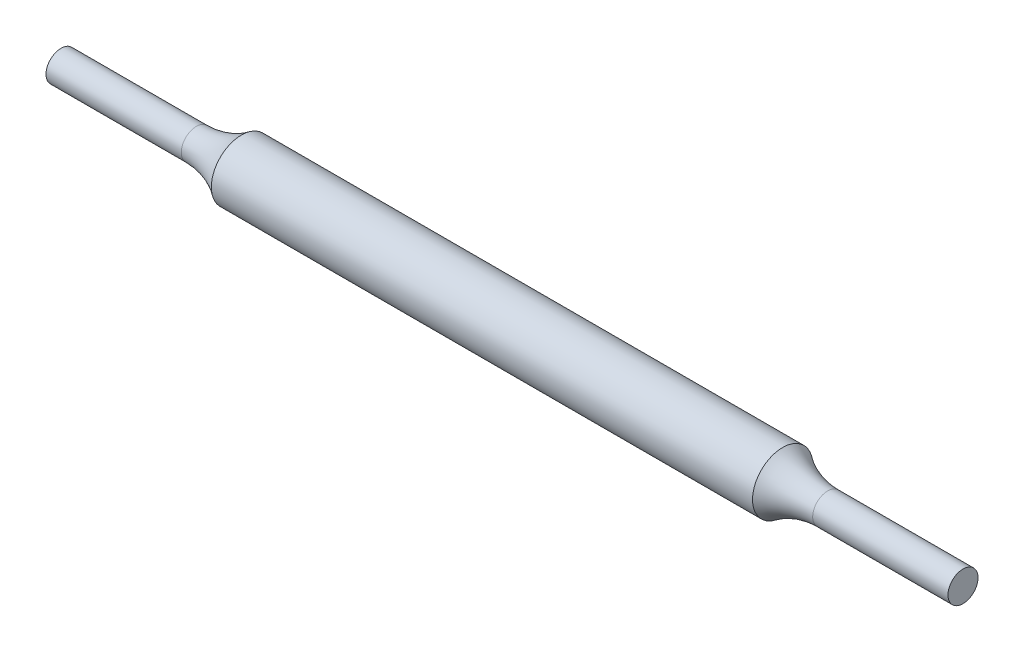
ISO-10303-21;
HEADER;
FILE_DESCRIPTION(('STEP AP214'),'2;1');
FILE_NAME('part.step','',(''),(''),'','','');
FILE_SCHEMA(('AUTOMOTIVE_DESIGN { 1 0 10303 214 1 1 1 1 }'));
ENDSEC;
DATA;
#1=APPLICATION_CONTEXT('core data for automotive mechanical design processes');
#2=APPLICATION_PROTOCOL_DEFINITION('international standard','automotive_design',2000,#1);
#3=PRODUCT_CONTEXT('',#1,'mechanical');
#4=PRODUCT('Part','Part','',(#3));
#5=PRODUCT_RELATED_PRODUCT_CATEGORY('part','',(#4));
#6=PRODUCT_DEFINITION_FORMATION('','',#4);
#7=PRODUCT_DEFINITION_CONTEXT('part definition',#1,'design');
#8=PRODUCT_DEFINITION('design','',#6,#7);
#9=PRODUCT_DEFINITION_SHAPE('','',#8);
#10=(LENGTH_UNIT() NAMED_UNIT(*) SI_UNIT(.MILLI.,.METRE.));
#11=(NAMED_UNIT(*) PLANE_ANGLE_UNIT() SI_UNIT($,.RADIAN.));
#12=(NAMED_UNIT(*) SI_UNIT($,.STERADIAN.) SOLID_ANGLE_UNIT());
#13=UNCERTAINTY_MEASURE_WITH_UNIT(LENGTH_MEASURE(1.E-05),#10,'distance_accuracy_value','');
#14=(GEOMETRIC_REPRESENTATION_CONTEXT(3) GLOBAL_UNCERTAINTY_ASSIGNED_CONTEXT((#13)) GLOBAL_UNIT_ASSIGNED_CONTEXT((#10,
#11,#12)) REPRESENTATION_CONTEXT('',''));
#15=CARTESIAN_POINT('',(0.,0.,0.));
#16=DIRECTION('',(0.,0.,1.));
#17=DIRECTION('',(1.,0.,0.));
#18=AXIS2_PLACEMENT_3D('',#15,#16,#17);
#19=CARTESIAN_POINT('',(0.,0.,0.));
#20=DIRECTION('',(1.,0.,0.));
#21=DIRECTION('',(0.,0.,-1.));
#22=AXIS2_PLACEMENT_3D('',#19,#20,#21);
#23=PLANE('',#22);
#24=CARTESIAN_POINT('',(0.,0.,0.));
#25=DIRECTION('',(-1.,0.,0.));
#26=DIRECTION('',(0.,0.,1.));
#27=AXIS2_PLACEMENT_3D('',#24,#25,#26);
#28=CIRCLE('',#27,1.);
#29=CARTESIAN_POINT('',(0.,0.,1.));
#30=VERTEX_POINT('',#29);
#31=EDGE_CURVE('E57',#30,#30,#28,.T.);
#32=ORIENTED_EDGE('',*,*,#31,.T.);
#33=EDGE_LOOP('',(#32));
#34=FACE_BOUND('',#33,.T.);
#35=ADVANCED_FACE('F35',(#34),#23,.F.);
#36=CARTESIAN_POINT('',(60.,0.,0.));
#37=DIRECTION('',(-1.,0.,0.));
#38=DIRECTION('',(0.,0.,1.));
#39=AXIS2_PLACEMENT_3D('',#36,#37,#38);
#40=PLANE('',#39);
#41=CARTESIAN_POINT('',(60.,0.,0.));
#42=DIRECTION('',(-1.,0.,0.));
#43=DIRECTION('',(0.,0.,1.));
#44=AXIS2_PLACEMENT_3D('',#41,#42,#43);
#45=CIRCLE('',#44,1.);
#46=CARTESIAN_POINT('',(60.,0.,1.));
#47=VERTEX_POINT('',#46);
#48=EDGE_CURVE('E10',#47,#47,#45,.T.);
#49=ORIENTED_EDGE('',*,*,#48,.F.);
#50=EDGE_LOOP('',(#49));
#51=FACE_BOUND('',#50,.T.);
#52=ADVANCED_FACE('F87',(#51),#40,.F.);
#53=CARTESIAN_POINT('',(0.,0.,0.));
#54=DIRECTION('',(-1.,0.,0.));
#55=DIRECTION('',(0.,0.,1.));
#56=AXIS2_PLACEMENT_3D('',#53,#54,#55);
#57=CYLINDRICAL_SURFACE('',#56,1.00000000000001);
#58=CARTESIAN_POINT('',(51.,0.,0.));
#59=DIRECTION('',(-1.,0.,0.));
#60=DIRECTION('',(0.,0.,1.));
#61=AXIS2_PLACEMENT_3D('',#58,#59,#60);
#62=CIRCLE('',#61,1.00000000000002);
#63=CARTESIAN_POINT('',(51.,0.,1.00000000000002));
#64=VERTEX_POINT('',#63);
#65=EDGE_CURVE('E41',#64,#64,#62,.T.);
#66=ORIENTED_EDGE('',*,*,#65,.F.);
#67=EDGE_LOOP('',(#66));
#68=FACE_BOUND('',#67,.T.);
#69=ORIENTED_EDGE('',*,*,#48,.T.);
#70=EDGE_LOOP('',(#69));
#71=FACE_BOUND('',#70,.T.);
#72=ADVANCED_FACE('F82',(#68,#71),#57,.T.);
#73=CARTESIAN_POINT('',(51.,0.,0.));
#74=DIRECTION('',(-1.,0.,0.));
#75=DIRECTION('',(0.,0.,1.));
#76=AXIS2_PLACEMENT_3D('',#73,#74,#75);
#77=TOROIDAL_SURFACE('',#76,6.00000000000003,5.00000000000002);
#78=CARTESIAN_POINT('',(48.,0.,0.));
#79=DIRECTION('',(-1.,0.,0.));
#80=DIRECTION('',(0.,0.,1.));
#81=AXIS2_PLACEMENT_3D('',#78,#79,#80);
#82=CIRCLE('',#81,2.00000000000001);
#83=CARTESIAN_POINT('',(48.,0.,2.00000000000001));
#84=VERTEX_POINT('',#83);
#85=EDGE_CURVE('E45',#84,#84,#82,.T.);
#86=ORIENTED_EDGE('',*,*,#85,.F.);
#87=EDGE_LOOP('',(#86));
#88=FACE_BOUND('',#87,.T.);
#89=ORIENTED_EDGE('',*,*,#65,.T.);
#90=EDGE_LOOP('',(#89));
#91=FACE_BOUND('',#90,.T.);
#92=ADVANCED_FACE('F77',(#88,#91),#77,.F.);
#93=CARTESIAN_POINT('',(0.,0.,0.));
#94=DIRECTION('',(-1.,0.,0.));
#95=DIRECTION('',(0.,0.,1.));
#96=AXIS2_PLACEMENT_3D('',#93,#94,#95);
#97=CYLINDRICAL_SURFACE('',#96,2.);
#98=CARTESIAN_POINT('',(12.,0.,0.));
#99=DIRECTION('',(-1.,0.,0.));
#100=DIRECTION('',(0.,0.,1.));
#101=AXIS2_PLACEMENT_3D('',#98,#99,#100);
#102=CIRCLE('',#101,2.);
#103=CARTESIAN_POINT('',(12.,0.,2.));
#104=VERTEX_POINT('',#103);
#105=EDGE_CURVE('E49',#104,#104,#102,.T.);
#106=ORIENTED_EDGE('',*,*,#105,.F.);
#107=EDGE_LOOP('',(#106));
#108=FACE_BOUND('',#107,.T.);
#109=ORIENTED_EDGE('',*,*,#85,.T.);
#110=EDGE_LOOP('',(#109));
#111=FACE_BOUND('',#110,.T.);
#112=ADVANCED_FACE('F71',(#108,#111),#97,.T.);
#113=CARTESIAN_POINT('',(9.,0.,0.));
#114=DIRECTION('',(-1.,0.,0.));
#115=DIRECTION('',(0.,0.,1.));
#116=AXIS2_PLACEMENT_3D('',#113,#114,#115);
#117=TOROIDAL_SURFACE('',#116,6.00000000000001,5.);
#118=CARTESIAN_POINT('',(9.,0.,0.));
#119=DIRECTION('',(-1.,0.,0.));
#120=DIRECTION('',(0.,0.,1.));
#121=AXIS2_PLACEMENT_3D('',#118,#119,#120);
#122=CIRCLE('',#121,1.);
#123=CARTESIAN_POINT('',(9.,0.,1.));
#124=VERTEX_POINT('',#123);
#125=EDGE_CURVE('E54',#124,#124,#122,.T.);
#126=ORIENTED_EDGE('',*,*,#125,.F.);
#127=EDGE_LOOP('',(#126));
#128=FACE_BOUND('',#127,.T.);
#129=ORIENTED_EDGE('',*,*,#105,.T.);
#130=EDGE_LOOP('',(#129));
#131=FACE_BOUND('',#130,.T.);
#132=ADVANCED_FACE('F65',(#128,#131),#117,.F.);
#133=CARTESIAN_POINT('',(0.,0.,0.));
#134=DIRECTION('',(-1.,0.,0.));
#135=DIRECTION('',(0.,0.,1.));
#136=AXIS2_PLACEMENT_3D('',#133,#134,#135);
#137=CYLINDRICAL_SURFACE('',#136,1.);
#138=ORIENTED_EDGE('',*,*,#31,.F.);
#139=EDGE_LOOP('',(#138));
#140=FACE_BOUND('',#139,.T.);
#141=ORIENTED_EDGE('',*,*,#125,.T.);
#142=EDGE_LOOP('',(#141));
#143=FACE_BOUND('',#142,.T.);
#144=ADVANCED_FACE('F62',(#140,#143),#137,.T.);
#145=CLOSED_SHELL('',(#35,#52,#72,#92,#112,#132,#144));
#146=MANIFOLD_SOLID_BREP('B2',#145);
#147=ADVANCED_BREP_SHAPE_REPRESENTATION('',(#18,#146),#14);
#148=SHAPE_DEFINITION_REPRESENTATION(#9,#147);
ENDSEC;
END-ISO-10303-21;
